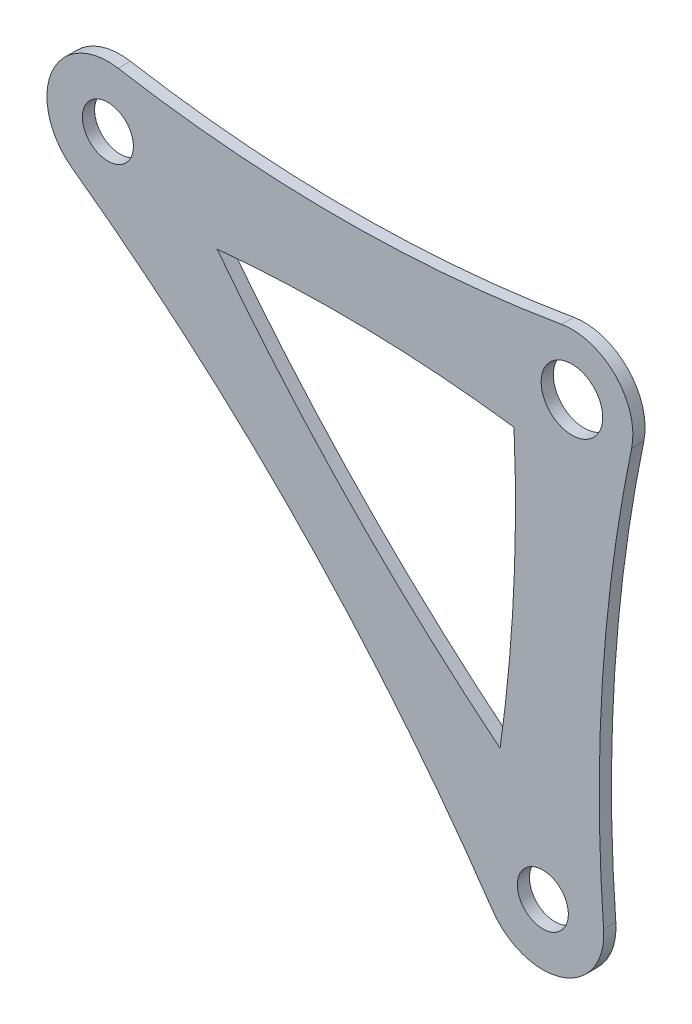
ISO-10303-21;
HEADER;
FILE_DESCRIPTION(('STEP AP214'),'2;1');
FILE_NAME('part.step','',(''),(''),'','','');
FILE_SCHEMA(('AUTOMOTIVE_DESIGN { 1 0 10303 214 1 1 1 1 }'));
ENDSEC;
DATA;
#1=APPLICATION_CONTEXT('core data for automotive mechanical design processes');
#2=APPLICATION_PROTOCOL_DEFINITION('international standard','automotive_design',2000,#1);
#3=PRODUCT_CONTEXT('',#1,'mechanical');
#4=PRODUCT('Part','Part','',(#3));
#5=PRODUCT_RELATED_PRODUCT_CATEGORY('part','',(#4));
#6=PRODUCT_DEFINITION_FORMATION('','',#4);
#7=PRODUCT_DEFINITION_CONTEXT('part definition',#1,'design');
#8=PRODUCT_DEFINITION('design','',#6,#7);
#9=PRODUCT_DEFINITION_SHAPE('','',#8);
#10=(LENGTH_UNIT() NAMED_UNIT(*) SI_UNIT(.MILLI.,.METRE.));
#11=(NAMED_UNIT(*) PLANE_ANGLE_UNIT() SI_UNIT($,.RADIAN.));
#12=(NAMED_UNIT(*) SI_UNIT($,.STERADIAN.) SOLID_ANGLE_UNIT());
#13=UNCERTAINTY_MEASURE_WITH_UNIT(LENGTH_MEASURE(1.E-05),#10,'distance_accuracy_value','');
#14=(GEOMETRIC_REPRESENTATION_CONTEXT(3) GLOBAL_UNCERTAINTY_ASSIGNED_CONTEXT((#13)) GLOBAL_UNIT_ASSIGNED_CONTEXT((#10,
#11,#12)) REPRESENTATION_CONTEXT('',''));
#15=CARTESIAN_POINT('',(0.,0.,0.));
#16=DIRECTION('',(0.,0.,1.));
#17=DIRECTION('',(1.,0.,0.));
#18=AXIS2_PLACEMENT_3D('',#15,#16,#17);
#19=CARTESIAN_POINT('',(-30.03,175.33696472792,1.58));
#20=DIRECTION('',(0.,0.,-1.));
#21=DIRECTION('',(-1.,0.,0.));
#22=AXIS2_PLACEMENT_3D('',#19,#20,#21);
#23=CYLINDRICAL_SURFACE('',#22,170.);
#24=CARTESIAN_POINT('',(-30.03,175.33696472792,0.));
#25=DIRECTION('',(0.,0.,1.));
#26=DIRECTION('',(1.,0.,0.));
#27=AXIS2_PLACEMENT_3D('',#24,#25,#26);
#28=CIRCLE('',#27,170.);
#29=CARTESIAN_POINT('',(-1.33192815785036,7.77676458318788,0.));
#30=VERTEX_POINT('',#29);
#31=CARTESIAN_POINT('',(-58.7280718421496,7.77676458318788,0.));
#32=VERTEX_POINT('',#31);
#33=EDGE_CURVE('E178',#30,#32,#28,.F.);
#34=ORIENTED_EDGE('',*,*,#33,.T.);
#35=DIRECTION('',(0.,0.,-1.));
#36=VECTOR('',#35,1.);
#37=CARTESIAN_POINT('',(-58.7280718421496,7.77676458318788,1.58));
#38=LINE('',#37,#36);
#39=CARTESIAN_POINT('',(-58.7280718421496,7.77676458318788,1.58));
#40=VERTEX_POINT('',#39);
#41=EDGE_CURVE('E11',#40,#32,#38,.T.);
#42=ORIENTED_EDGE('',*,*,#41,.F.);
#43=CARTESIAN_POINT('',(-30.03,175.33696472792,1.58));
#44=DIRECTION('',(0.,0.,1.));
#45=DIRECTION('',(1.,0.,0.));
#46=AXIS2_PLACEMENT_3D('',#43,#44,#45);
#47=CIRCLE('',#46,170.);
#48=CARTESIAN_POINT('',(-1.33192815785036,7.77676458318788,1.58));
#49=VERTEX_POINT('',#48);
#50=EDGE_CURVE('E242',#49,#40,#47,.F.);
#51=ORIENTED_EDGE('',*,*,#50,.F.);
#52=DIRECTION('',(0.,0.,-1.));
#53=VECTOR('',#52,1.);
#54=CARTESIAN_POINT('',(-1.33192815785036,7.77676458318788,1.58));
#55=LINE('',#54,#53);
#56=EDGE_CURVE('E207',#49,#30,#55,.T.);
#57=ORIENTED_EDGE('',*,*,#56,.T.);
#58=EDGE_LOOP('',(#34,#42,#51,#57));
#59=FACE_BOUND('',#58,.T.);
#60=ADVANCED_FACE('F41',(#59),#23,.F.);
#61=CARTESIAN_POINT('',(-60.06,0.,1.58));
#62=DIRECTION('',(0.,0.,-1.));
#63=DIRECTION('',(-1.,0.,0.));
#64=AXIS2_PLACEMENT_3D('',#61,#62,#63);
#65=CYLINDRICAL_SURFACE('',#64,7.89);
#66=CARTESIAN_POINT('',(-60.06,0.,0.));
#67=DIRECTION('',(0.,0.,1.));
#68=DIRECTION('',(1.,0.,0.));
#69=AXIS2_PLACEMENT_3D('',#66,#67,#68);
#70=CIRCLE('',#69,7.89);
#71=CARTESIAN_POINT('',(-64.6781402375793,-6.39725571992014,0.));
#72=VERTEX_POINT('',#71);
#73=EDGE_CURVE('E182',#32,#72,#70,.T.);
#74=ORIENTED_EDGE('',*,*,#73,.T.);
#75=DIRECTION('',(0.,0.,-1.));
#76=VECTOR('',#75,1.);
#77=CARTESIAN_POINT('',(-64.6781402375793,-6.39725571992014,1.58));
#78=LINE('',#77,#76);
#79=CARTESIAN_POINT('',(-64.6781402375793,-6.39725571992014,1.58));
#80=VERTEX_POINT('',#79);
#81=EDGE_CURVE('E52',#80,#72,#78,.T.);
#82=ORIENTED_EDGE('',*,*,#81,.F.);
#83=CARTESIAN_POINT('',(-60.06,0.,1.58));
#84=DIRECTION('',(0.,0.,1.));
#85=DIRECTION('',(1.,0.,0.));
#86=AXIS2_PLACEMENT_3D('',#83,#84,#85);
#87=CIRCLE('',#86,7.89);
#88=EDGE_CURVE('E247',#40,#80,#87,.T.);
#89=ORIENTED_EDGE('',*,*,#88,.F.);
#90=ORIENTED_EDGE('',*,*,#41,.T.);
#91=EDGE_LOOP('',(#74,#82,#89,#90));
#92=FACE_BOUND('',#91,.T.);
#93=ADVANCED_FACE('F261',(#92),#65,.T.);
#94=CARTESIAN_POINT('',(-196.374154617217,-188.828502485704,1.58));
#95=DIRECTION('',(0.,0.,-1.));
#96=DIRECTION('',(-1.,0.,0.));
#97=AXIS2_PLACEMENT_3D('',#94,#95,#96);
#98=CYLINDRICAL_SURFACE('',#97,225.);
#99=CARTESIAN_POINT('',(-196.374154617217,-188.828502485704,0.));
#100=DIRECTION('',(0.,0.,1.));
#101=DIRECTION('',(1.,0.,0.));
#102=AXIS2_PLACEMENT_3D('',#99,#100,#101);
#103=CIRCLE('',#102,225.);
#104=CARTESIAN_POINT('',(-10.2923908909579,-62.3430202811258,0.));
#105=VERTEX_POINT('',#104);
#106=EDGE_CURVE('E185',#72,#105,#103,.F.);
#107=ORIENTED_EDGE('',*,*,#106,.T.);
#108=DIRECTION('',(0.,0.,-1.));
#109=VECTOR('',#108,1.);
#110=CARTESIAN_POINT('',(-10.2923908909579,-62.3430202811258,1.58));
#111=LINE('',#110,#109);
#112=CARTESIAN_POINT('',(-10.2923908909579,-62.3430202811258,1.58));
#113=VERTEX_POINT('',#112);
#114=EDGE_CURVE('E142',#113,#105,#111,.T.);
#115=ORIENTED_EDGE('',*,*,#114,.F.);
#116=CARTESIAN_POINT('',(-196.374154617217,-188.828502485704,1.58));
#117=DIRECTION('',(0.,0.,1.));
#118=DIRECTION('',(1.,0.,0.));
#119=AXIS2_PLACEMENT_3D('',#116,#117,#118);
#120=CIRCLE('',#119,225.);
#121=EDGE_CURVE('E131',#80,#113,#120,.F.);
#122=ORIENTED_EDGE('',*,*,#121,.F.);
#123=ORIENTED_EDGE('',*,*,#81,.T.);
#124=EDGE_LOOP('',(#107,#115,#122,#123));
#125=FACE_BOUND('',#124,.T.);
#126=ADVANCED_FACE('F264',(#125),#98,.F.);
#127=CARTESIAN_POINT('',(-3.76712370962372,-57.9075960384852,1.58));
#128=DIRECTION('',(0.,0.,-1.));
#129=DIRECTION('',(-1.,0.,0.));
#130=AXIS2_PLACEMENT_3D('',#127,#128,#129);
#131=CYLINDRICAL_SURFACE('',#130,7.89);
#132=CARTESIAN_POINT('',(-3.76712370962372,-57.9075960384852,0.));
#133=DIRECTION('',(0.,0.,1.));
#134=DIRECTION('',(1.,0.,0.));
#135=AXIS2_PLACEMENT_3D('',#132,#133,#134);
#136=CIRCLE('',#135,7.89);
#137=CARTESIAN_POINT('',(4.10065843107563,-57.3159000130698,0.));
#138=VERTEX_POINT('',#137);
#139=EDGE_CURVE('E140',#105,#138,#136,.T.);
#140=ORIENTED_EDGE('',*,*,#139,.T.);
#141=DIRECTION('',(0.,0.,-1.));
#142=VECTOR('',#141,1.);
#143=CARTESIAN_POINT('',(4.10065843107563,-57.3159000130698,1.58));
#144=LINE('',#143,#142);
#145=CARTESIAN_POINT('',(4.10065843107563,-57.3159000130698,1.58));
#146=VERTEX_POINT('',#145);
#147=EDGE_CURVE('E137',#146,#138,#144,.T.);
#148=ORIENTED_EDGE('',*,*,#147,.F.);
#149=CARTESIAN_POINT('',(-3.76712370962372,-57.9075960384852,1.58));
#150=DIRECTION('',(0.,0.,1.));
#151=DIRECTION('',(1.,0.,0.));
#152=AXIS2_PLACEMENT_3D('',#149,#150,#151);
#153=CIRCLE('',#152,7.89);
#154=EDGE_CURVE('E124',#113,#146,#153,.T.);
#155=ORIENTED_EDGE('',*,*,#154,.F.);
#156=ORIENTED_EDGE('',*,*,#114,.T.);
#157=EDGE_LOOP('',(#140,#148,#155,#156));
#158=FACE_BOUND('',#157,.T.);
#159=ADVANCED_FACE('F138',(#158),#131,.T.);
#160=CARTESIAN_POINT('',(203.537468081249,-42.317268190119,1.58));
#161=DIRECTION('',(0.,0.,-1.));
#162=DIRECTION('',(-1.,0.,0.));
#163=AXIS2_PLACEMENT_3D('',#160,#161,#162);
#164=CYLINDRICAL_SURFACE('',#163,200.);
#165=CARTESIAN_POINT('',(203.537468081249,-42.317268190119,0.));
#166=DIRECTION('',(0.,0.,1.));
#167=DIRECTION('',(1.,0.,0.));
#168=AXIS2_PLACEMENT_3D('',#165,#166,#167);
#169=CIRCLE('',#168,200.);
#170=CARTESIAN_POINT('',(7.72480938554551,-1.60605727076838,0.));
#171=VERTEX_POINT('',#170);
#172=EDGE_CURVE('E93',#138,#171,#169,.F.);
#173=ORIENTED_EDGE('',*,*,#172,.T.);
#174=DIRECTION('',(0.,0.,-1.));
#175=VECTOR('',#174,1.);
#176=CARTESIAN_POINT('',(7.72480938554551,-1.60605727076838,1.58));
#177=LINE('',#176,#175);
#178=CARTESIAN_POINT('',(7.72480938554551,-1.60605727076838,1.58));
#179=VERTEX_POINT('',#178);
#180=EDGE_CURVE('E143',#179,#171,#177,.T.);
#181=ORIENTED_EDGE('',*,*,#180,.F.);
#182=CARTESIAN_POINT('',(203.537468081249,-42.317268190119,1.58));
#183=DIRECTION('',(0.,0.,1.));
#184=DIRECTION('',(1.,0.,0.));
#185=AXIS2_PLACEMENT_3D('',#182,#183,#184);
#186=CIRCLE('',#185,200.);
#187=EDGE_CURVE('E129',#146,#179,#186,.F.);
#188=ORIENTED_EDGE('',*,*,#187,.F.);
#189=ORIENTED_EDGE('',*,*,#147,.T.);
#190=EDGE_LOOP('',(#173,#181,#188,#189));
#191=FACE_BOUND('',#190,.T.);
#192=ADVANCED_FACE('F145',(#191),#164,.F.);
#193=CARTESIAN_POINT('',(132.547030907594,130.920906447219,1.58));
#194=DIRECTION('',(0.,0.,-1.));
#195=DIRECTION('',(-1.,0.,0.));
#196=AXIS2_PLACEMENT_3D('',#193,#194,#195);
#197=CYLINDRICAL_SURFACE('',#196,225.);
#198=CARTESIAN_POINT('',(132.547030907594,130.920906447219,0.));
#199=DIRECTION('',(0.,0.,1.));
#200=DIRECTION('',(1.,0.,0.));
#201=AXIS2_PLACEMENT_3D('',#198,#199,#200);
#202=CIRCLE('',#201,225.);
#203=CARTESIAN_POINT('',(-45.9329006907997,-6.08242933929765,0.));
#204=VERTEX_POINT('',#203);
#205=CARTESIAN_POINT('',(-9.29524167465695,-43.7381033653376,0.));
#206=VERTEX_POINT('',#205);
#207=EDGE_CURVE('E166',#204,#206,#202,.T.);
#208=ORIENTED_EDGE('',*,*,#207,.F.);
#209=DIRECTION('',(0.,0.,-1.));
#210=VECTOR('',#209,1.);
#211=CARTESIAN_POINT('',(-45.9329006907997,-6.08242933929765,1.58));
#212=LINE('',#211,#210);
#213=CARTESIAN_POINT('',(-45.9329006907997,-6.08242933929765,1.58));
#214=VERTEX_POINT('',#213);
#215=EDGE_CURVE('E45',#214,#204,#212,.T.);
#216=ORIENTED_EDGE('',*,*,#215,.F.);
#217=CARTESIAN_POINT('',(132.547030907594,130.920906447219,1.58));
#218=DIRECTION('',(0.,0.,1.));
#219=DIRECTION('',(1.,0.,0.));
#220=AXIS2_PLACEMENT_3D('',#217,#218,#219);
#221=CIRCLE('',#220,225.);
#222=CARTESIAN_POINT('',(-9.29524167465695,-43.7381033653376,1.58));
#223=VERTEX_POINT('',#222);
#224=EDGE_CURVE('E206',#214,#223,#221,.T.);
#225=ORIENTED_EDGE('',*,*,#224,.T.);
#226=DIRECTION('',(0.,0.,-1.));
#227=VECTOR('',#226,1.);
#228=CARTESIAN_POINT('',(-9.29524167465695,-43.7381033653376,1.58));
#229=LINE('',#228,#227);
#230=EDGE_CURVE('E165',#223,#206,#229,.T.);
#231=ORIENTED_EDGE('',*,*,#230,.T.);
#232=EDGE_LOOP('',(#208,#216,#225,#231));
#233=FACE_BOUND('',#232,.T.);
#234=ADVANCED_FACE('F43',(#233),#197,.F.);
#235=CARTESIAN_POINT('',(-30.03,-175.33696472792,1.58));
#236=DIRECTION('',(0.,0.,-1.));
#237=DIRECTION('',(-1.,0.,0.));
#238=AXIS2_PLACEMENT_3D('',#235,#236,#237);
#239=CYLINDRICAL_SURFACE('',#238,170.);
#240=CARTESIAN_POINT('',(-30.03,-175.33696472792,0.));
#241=DIRECTION('',(0.,0.,1.));
#242=DIRECTION('',(1.,0.,0.));
#243=AXIS2_PLACEMENT_3D('',#240,#241,#242);
#244=CIRCLE('',#243,170.);
#245=CARTESIAN_POINT('',(-7.49623434821273,-6.83702583905814,0.));
#246=VERTEX_POINT('',#245);
#247=EDGE_CURVE('E170',#246,#204,#244,.T.);
#248=ORIENTED_EDGE('',*,*,#247,.F.);
#249=DIRECTION('',(0.,0.,-1.));
#250=VECTOR('',#249,1.);
#251=CARTESIAN_POINT('',(-7.49623434821273,-6.83702583905814,1.58));
#252=LINE('',#251,#250);
#253=CARTESIAN_POINT('',(-7.49623434821273,-6.83702583905814,1.58));
#254=VERTEX_POINT('',#253);
#255=EDGE_CURVE('E218',#254,#246,#252,.T.);
#256=ORIENTED_EDGE('',*,*,#255,.F.);
#257=CARTESIAN_POINT('',(-30.03,-175.33696472792,1.58));
#258=DIRECTION('',(0.,0.,1.));
#259=DIRECTION('',(1.,0.,0.));
#260=AXIS2_PLACEMENT_3D('',#257,#258,#259);
#261=CIRCLE('',#260,170.);
#262=EDGE_CURVE('E231',#254,#214,#261,.T.);
#263=ORIENTED_EDGE('',*,*,#262,.T.);
#264=ORIENTED_EDGE('',*,*,#215,.T.);
#265=EDGE_LOOP('',(#248,#256,#263,#264));
#266=FACE_BOUND('',#265,.T.);
#267=ADVANCED_FACE('F229',(#266),#239,.F.);
#268=CARTESIAN_POINT('',(0.,0.,1.58));
#269=DIRECTION('',(0.,0.,-1.));
#270=DIRECTION('',(-1.,0.,0.));
#271=AXIS2_PLACEMENT_3D('',#268,#269,#270);
#272=CYLINDRICAL_SURFACE('',#271,3.985);
#273=CARTESIAN_POINT('',(0.,0.,1.58));
#274=DIRECTION('',(0.,0.,1.));
#275=DIRECTION('',(1.,0.,0.));
#276=AXIS2_PLACEMENT_3D('',#273,#274,#275);
#277=CIRCLE('',#276,3.985);
#278=CARTESIAN_POINT('',(-3.985,0.,1.58));
#279=VERTEX_POINT('',#278);
#280=EDGE_CURVE('E157',#279,#279,#277,.T.);
#281=CARTESIAN_POINT('',(0.,0.,0.));
#282=DIRECTION('',(0.,0.,1.));
#283=DIRECTION('',(1.,0.,0.));
#284=AXIS2_PLACEMENT_3D('',#281,#282,#283);
#285=CIRCLE('',#284,3.985);
#286=CARTESIAN_POINT('',(-3.985,0.,0.));
#287=VERTEX_POINT('',#286);
#288=EDGE_CURVE('E198',#287,#287,#285,.T.);
#289=CARTESIAN_POINT('',(-3.985,0.,1.58));
#290=CARTESIAN_POINT('',(-3.985,0.,1.56354166666667));
#291=CARTESIAN_POINT('',(-3.985,0.,1.54708333333333));
#292=CARTESIAN_POINT('',(-3.985,0.,1.51416666666667));
#293=CARTESIAN_POINT('',(-3.985,0.,1.49770833333333));
#294=CARTESIAN_POINT('',(-3.985,0.,1.46479166666667));
#295=CARTESIAN_POINT('',(-3.985,0.,1.44833333333333));
#296=CARTESIAN_POINT('',(-3.985,0.,1.41541666666667));
#297=CARTESIAN_POINT('',(-3.985,0.,1.39895833333333));
#298=CARTESIAN_POINT('',(-3.985,0.,1.36604166666667));
#299=CARTESIAN_POINT('',(-3.985,0.,1.34958333333333));
#300=CARTESIAN_POINT('',(-3.985,0.,1.31666666666667));
#301=CARTESIAN_POINT('',(-3.985,0.,1.30020833333333));
#302=CARTESIAN_POINT('',(-3.985,0.,1.26729166666667));
#303=CARTESIAN_POINT('',(-3.985,0.,1.25083333333333));
#304=CARTESIAN_POINT('',(-3.985,0.,1.21791666666667));
#305=CARTESIAN_POINT('',(-3.985,0.,1.20145833333333));
#306=CARTESIAN_POINT('',(-3.985,0.,1.16854166666667));
#307=CARTESIAN_POINT('',(-3.985,0.,1.15208333333333));
#308=CARTESIAN_POINT('',(-3.985,0.,1.11916666666667));
#309=CARTESIAN_POINT('',(-3.985,0.,1.10270833333333));
#310=CARTESIAN_POINT('',(-3.985,0.,1.06979166666667));
#311=CARTESIAN_POINT('',(-3.985,0.,1.05333333333333));
#312=CARTESIAN_POINT('',(-3.985,0.,1.02041666666667));
#313=CARTESIAN_POINT('',(-3.985,0.,1.00395833333333));
#314=CARTESIAN_POINT('',(-3.985,0.,0.971041666666667));
#315=CARTESIAN_POINT('',(-3.985,0.,0.954583333333333));
#316=CARTESIAN_POINT('',(-3.985,0.,0.921666666666667));
#317=CARTESIAN_POINT('',(-3.985,0.,0.905208333333333));
#318=CARTESIAN_POINT('',(-3.985,0.,0.872291666666667));
#319=CARTESIAN_POINT('',(-3.985,0.,0.855833333333333));
#320=CARTESIAN_POINT('',(-3.985,0.,0.822916666666667));
#321=CARTESIAN_POINT('',(-3.985,0.,0.806458333333333));
#322=CARTESIAN_POINT('',(-3.985,0.,0.773541666666667));
#323=CARTESIAN_POINT('',(-3.985,0.,0.757083333333333));
#324=CARTESIAN_POINT('',(-3.985,0.,0.724166666666667));
#325=CARTESIAN_POINT('',(-3.985,0.,0.707708333333333));
#326=CARTESIAN_POINT('',(-3.985,0.,0.674791666666667));
#327=CARTESIAN_POINT('',(-3.985,0.,0.658333333333333));
#328=CARTESIAN_POINT('',(-3.985,0.,0.625416666666667));
#329=CARTESIAN_POINT('',(-3.985,0.,0.608958333333333));
#330=CARTESIAN_POINT('',(-3.985,0.,0.576041666666667));
#331=CARTESIAN_POINT('',(-3.985,0.,0.559583333333333));
#332=CARTESIAN_POINT('',(-3.985,0.,0.526666666666667));
#333=CARTESIAN_POINT('',(-3.985,0.,0.510208333333333));
#334=CARTESIAN_POINT('',(-3.985,0.,0.477291666666667));
#335=CARTESIAN_POINT('',(-3.985,0.,0.460833333333333));
#336=CARTESIAN_POINT('',(-3.985,0.,0.427916666666667));
#337=CARTESIAN_POINT('',(-3.985,0.,0.411458333333333));
#338=CARTESIAN_POINT('',(-3.985,0.,0.378541666666667));
#339=CARTESIAN_POINT('',(-3.985,0.,0.362083333333333));
#340=CARTESIAN_POINT('',(-3.985,0.,0.329166666666667));
#341=CARTESIAN_POINT('',(-3.985,0.,0.312708333333333));
#342=CARTESIAN_POINT('',(-3.985,0.,0.279791666666667));
#343=CARTESIAN_POINT('',(-3.985,0.,0.263333333333333));
#344=CARTESIAN_POINT('',(-3.985,0.,0.230416666666667));
#345=CARTESIAN_POINT('',(-3.985,0.,0.213958333333333));
#346=CARTESIAN_POINT('',(-3.985,0.,0.181041666666667));
#347=CARTESIAN_POINT('',(-3.985,0.,0.164583333333333));
#348=CARTESIAN_POINT('',(-3.985,0.,0.131666666666667));
#349=CARTESIAN_POINT('',(-3.985,0.,0.115208333333333));
#350=CARTESIAN_POINT('',(-3.985,0.,0.0822916666666667));
#351=CARTESIAN_POINT('',(-3.985,0.,0.0658333333333333));
#352=CARTESIAN_POINT('',(-3.985,0.,0.0329166666666666));
#353=CARTESIAN_POINT('',(-3.985,0.,0.0164583333333333));
#354=CARTESIAN_POINT('',(-3.985,0.,0.));
#355=B_SPLINE_CURVE_WITH_KNOTS('',3,(#289,#290,#291,#292,#293,#294,#295,#296,#297,#298,#299,
#300,#301,#302,#303,#304,#305,#306,#307,#308,#309,#310,#311,#312,#313,#314,#315,#316,#317,#318,
#319,#320,#321,#322,#323,#324,#325,#326,#327,#328,#329,#330,#331,#332,#333,#334,#335,#336,#337,
#338,#339,#340,#341,#342,#343,#344,#345,#346,#347,#348,#349,#350,#351,#352,#353,#354),
.UNSPECIFIED.,.F.,.F.,(4,2,2,2,2,2,2,2,2,2,2,2,2,2,2,2,2,2,2,2,2,2,2,2,2,2,2,2,2,2,2,2,4),(0.,
0.0493750000000002,0.0987500000000001,0.148125,0.1975,0.246875,0.29625,0.345625,0.395,0.444375,
0.49375,0.543125,0.5925,0.641875,0.69125,0.740625,0.79,0.839375,0.88875,0.938125,0.9875,
1.036875,1.08625,1.135625,1.185,1.234375,1.28375,1.333125,1.3825,1.431875,1.48125,1.530625,
1.58),.UNSPECIFIED.);
#356=EDGE_CURVE('BSEAM278',#279,#287,#355,.T.);
#357=ORIENTED_EDGE('',*,*,#280,.T.);
#358=ORIENTED_EDGE('',*,*,#288,.F.);
#359=ORIENTED_EDGE('',*,*,#356,.T.);
#360=ORIENTED_EDGE('',*,*,#356,.F.);
#361=EDGE_LOOP('',(#357,#359,#358,#360));
#362=FACE_BOUND('',#361,.T.);
#363=ADVANCED_FACE('F278',(#362),#272,.F.);
#364=CARTESIAN_POINT('',(-3.76712370962372,-57.9075960384852,1.58));
#365=DIRECTION('',(0.,0.,-1.));
#366=DIRECTION('',(-1.,0.,0.));
#367=AXIS2_PLACEMENT_3D('',#364,#365,#366);
#368=CYLINDRICAL_SURFACE('',#367,3.30000000000001);
#369=CARTESIAN_POINT('',(-3.76712370962372,-57.9075960384852,1.58));
#370=DIRECTION('',(0.,0.,1.));
#371=DIRECTION('',(1.,0.,0.));
#372=AXIS2_PLACEMENT_3D('',#369,#370,#371);
#373=CIRCLE('',#372,3.30000000000001);
#374=CARTESIAN_POINT('',(-7.06712370962372,-57.9075960384852,1.58));
#375=VERTEX_POINT('',#374);
#376=EDGE_CURVE('E150',#375,#375,#373,.T.);
#377=CARTESIAN_POINT('',(-3.76712370962372,-57.9075960384852,0.));
#378=DIRECTION('',(0.,0.,1.));
#379=DIRECTION('',(1.,0.,0.));
#380=AXIS2_PLACEMENT_3D('',#377,#378,#379);
#381=CIRCLE('',#380,3.30000000000001);
#382=CARTESIAN_POINT('',(-7.06712370962372,-57.9075960384852,0.));
#383=VERTEX_POINT('',#382);
#384=EDGE_CURVE('E194',#383,#383,#381,.T.);
#385=CARTESIAN_POINT('',(-7.06712370962372,-57.9075960384852,1.58));
#386=CARTESIAN_POINT('',(-7.06712370962372,-57.9075960384852,1.56354166666667));
#387=CARTESIAN_POINT('',(-7.06712370962372,-57.9075960384852,1.54708333333333));
#388=CARTESIAN_POINT('',(-7.06712370962372,-57.9075960384852,1.51416666666667));
#389=CARTESIAN_POINT('',(-7.06712370962372,-57.9075960384852,1.49770833333333));
#390=CARTESIAN_POINT('',(-7.06712370962372,-57.9075960384852,1.46479166666667));
#391=CARTESIAN_POINT('',(-7.06712370962372,-57.9075960384852,1.44833333333333));
#392=CARTESIAN_POINT('',(-7.06712370962372,-57.9075960384852,1.41541666666667));
#393=CARTESIAN_POINT('',(-7.06712370962372,-57.9075960384852,1.39895833333333));
#394=CARTESIAN_POINT('',(-7.06712370962372,-57.9075960384852,1.36604166666667));
#395=CARTESIAN_POINT('',(-7.06712370962372,-57.9075960384852,1.34958333333333));
#396=CARTESIAN_POINT('',(-7.06712370962372,-57.9075960384852,1.31666666666667));
#397=CARTESIAN_POINT('',(-7.06712370962372,-57.9075960384852,1.30020833333333));
#398=CARTESIAN_POINT('',(-7.06712370962372,-57.9075960384852,1.26729166666667));
#399=CARTESIAN_POINT('',(-7.06712370962372,-57.9075960384852,1.25083333333333));
#400=CARTESIAN_POINT('',(-7.06712370962372,-57.9075960384852,1.21791666666667));
#401=CARTESIAN_POINT('',(-7.06712370962372,-57.9075960384852,1.20145833333333));
#402=CARTESIAN_POINT('',(-7.06712370962372,-57.9075960384852,1.16854166666667));
#403=CARTESIAN_POINT('',(-7.06712370962372,-57.9075960384852,1.15208333333333));
#404=CARTESIAN_POINT('',(-7.06712370962372,-57.9075960384852,1.11916666666667));
#405=CARTESIAN_POINT('',(-7.06712370962372,-57.9075960384852,1.10270833333333));
#406=CARTESIAN_POINT('',(-7.06712370962372,-57.9075960384852,1.06979166666667));
#407=CARTESIAN_POINT('',(-7.06712370962372,-57.9075960384852,1.05333333333333));
#408=CARTESIAN_POINT('',(-7.06712370962372,-57.9075960384852,1.02041666666667));
#409=CARTESIAN_POINT('',(-7.06712370962372,-57.9075960384852,1.00395833333333));
#410=CARTESIAN_POINT('',(-7.06712370962372,-57.9075960384852,0.971041666666667));
#411=CARTESIAN_POINT('',(-7.06712370962372,-57.9075960384852,0.954583333333333));
#412=CARTESIAN_POINT('',(-7.06712370962372,-57.9075960384852,0.921666666666667));
#413=CARTESIAN_POINT('',(-7.06712370962372,-57.9075960384852,0.905208333333333));
#414=CARTESIAN_POINT('',(-7.06712370962372,-57.9075960384852,0.872291666666667));
#415=CARTESIAN_POINT('',(-7.06712370962372,-57.9075960384852,0.855833333333333));
#416=CARTESIAN_POINT('',(-7.06712370962372,-57.9075960384852,0.822916666666667));
#417=CARTESIAN_POINT('',(-7.06712370962372,-57.9075960384852,0.806458333333333));
#418=CARTESIAN_POINT('',(-7.06712370962372,-57.9075960384852,0.773541666666667));
#419=CARTESIAN_POINT('',(-7.06712370962372,-57.9075960384852,0.757083333333333));
#420=CARTESIAN_POINT('',(-7.06712370962372,-57.9075960384852,0.724166666666667));
#421=CARTESIAN_POINT('',(-7.06712370962372,-57.9075960384852,0.707708333333333));
#422=CARTESIAN_POINT('',(-7.06712370962372,-57.9075960384852,0.674791666666667));
#423=CARTESIAN_POINT('',(-7.06712370962372,-57.9075960384852,0.658333333333333));
#424=CARTESIAN_POINT('',(-7.06712370962372,-57.9075960384852,0.625416666666667));
#425=CARTESIAN_POINT('',(-7.06712370962372,-57.9075960384852,0.608958333333333));
#426=CARTESIAN_POINT('',(-7.06712370962372,-57.9075960384852,0.576041666666667));
#427=CARTESIAN_POINT('',(-7.06712370962372,-57.9075960384852,0.559583333333333));
#428=CARTESIAN_POINT('',(-7.06712370962372,-57.9075960384852,0.526666666666667));
#429=CARTESIAN_POINT('',(-7.06712370962372,-57.9075960384852,0.510208333333333));
#430=CARTESIAN_POINT('',(-7.06712370962372,-57.9075960384852,0.477291666666667));
#431=CARTESIAN_POINT('',(-7.06712370962372,-57.9075960384852,0.460833333333333));
#432=CARTESIAN_POINT('',(-7.06712370962372,-57.9075960384852,0.427916666666667));
#433=CARTESIAN_POINT('',(-7.06712370962372,-57.9075960384852,0.411458333333333));
#434=CARTESIAN_POINT('',(-7.06712370962372,-57.9075960384852,0.378541666666667));
#435=CARTESIAN_POINT('',(-7.06712370962372,-57.9075960384852,0.362083333333333));
#436=CARTESIAN_POINT('',(-7.06712370962372,-57.9075960384852,0.329166666666667));
#437=CARTESIAN_POINT('',(-7.06712370962372,-57.9075960384852,0.312708333333333));
#438=CARTESIAN_POINT('',(-7.06712370962372,-57.9075960384852,0.279791666666667));
#439=CARTESIAN_POINT('',(-7.06712370962372,-57.9075960384852,0.263333333333333));
#440=CARTESIAN_POINT('',(-7.06712370962372,-57.9075960384852,0.230416666666667));
#441=CARTESIAN_POINT('',(-7.06712370962372,-57.9075960384852,0.213958333333333));
#442=CARTESIAN_POINT('',(-7.06712370962372,-57.9075960384852,0.181041666666667));
#443=CARTESIAN_POINT('',(-7.06712370962372,-57.9075960384852,0.164583333333333));
#444=CARTESIAN_POINT('',(-7.06712370962372,-57.9075960384852,0.131666666666667));
#445=CARTESIAN_POINT('',(-7.06712370962372,-57.9075960384852,0.115208333333333));
#446=CARTESIAN_POINT('',(-7.06712370962372,-57.9075960384852,0.0822916666666667));
#447=CARTESIAN_POINT('',(-7.06712370962372,-57.9075960384852,0.0658333333333333));
#448=CARTESIAN_POINT('',(-7.06712370962372,-57.9075960384852,0.0329166666666666));
#449=CARTESIAN_POINT('',(-7.06712370962372,-57.9075960384852,0.0164583333333333));
#450=CARTESIAN_POINT('',(-7.06712370962372,-57.9075960384852,0.));
#451=B_SPLINE_CURVE_WITH_KNOTS('',3,(#385,#386,#387,#388,#389,#390,#391,#392,#393,#394,#395,
#396,#397,#398,#399,#400,#401,#402,#403,#404,#405,#406,#407,#408,#409,#410,#411,#412,#413,#414,
#415,#416,#417,#418,#419,#420,#421,#422,#423,#424,#425,#426,#427,#428,#429,#430,#431,#432,#433,
#434,#435,#436,#437,#438,#439,#440,#441,#442,#443,#444,#445,#446,#447,#448,#449,#450),
.UNSPECIFIED.,.F.,.F.,(4,2,2,2,2,2,2,2,2,2,2,2,2,2,2,2,2,2,2,2,2,2,2,2,2,2,2,2,2,2,2,2,4),(0.,
0.0493750000000002,0.0987500000000001,0.148125,0.1975,0.246875,0.29625,0.345625,0.395,0.444375,
0.49375,0.543125,0.5925,0.641875,0.69125,0.740625,0.79,0.839375,0.88875,0.938125,0.9875,
1.036875,1.08625,1.135625,1.185,1.234375,1.28375,1.333125,1.3825,1.431875,1.48125,1.530625,
1.58),.UNSPECIFIED.);
#452=EDGE_CURVE('BSEAM270',#375,#383,#451,.T.);
#453=ORIENTED_EDGE('',*,*,#376,.T.);
#454=ORIENTED_EDGE('',*,*,#384,.F.);
#455=ORIENTED_EDGE('',*,*,#452,.T.);
#456=ORIENTED_EDGE('',*,*,#452,.F.);
#457=EDGE_LOOP('',(#453,#455,#454,#456));
#458=FACE_BOUND('',#457,.T.);
#459=ADVANCED_FACE('F270',(#458),#368,.F.);
#460=CARTESIAN_POINT('',(0.,0.,1.58));
#461=DIRECTION('',(0.,0.,-1.));
#462=DIRECTION('',(-1.,0.,0.));
#463=AXIS2_PLACEMENT_3D('',#460,#461,#462);
#464=CYLINDRICAL_SURFACE('',#463,7.89);
#465=CARTESIAN_POINT('',(0.,0.,0.));
#466=DIRECTION('',(0.,0.,1.));
#467=DIRECTION('',(1.,0.,0.));
#468=AXIS2_PLACEMENT_3D('',#465,#466,#467);
#469=CIRCLE('',#468,7.89);
#470=EDGE_CURVE('E99',#171,#30,#469,.T.);
#471=ORIENTED_EDGE('',*,*,#470,.T.);
#472=ORIENTED_EDGE('',*,*,#56,.F.);
#473=CARTESIAN_POINT('',(0.,0.,1.58));
#474=DIRECTION('',(0.,0.,1.));
#475=DIRECTION('',(1.,0.,0.));
#476=AXIS2_PLACEMENT_3D('',#473,#474,#475);
#477=CIRCLE('',#476,7.89);
#478=EDGE_CURVE('E61',#179,#49,#477,.T.);
#479=ORIENTED_EDGE('',*,*,#478,.F.);
#480=ORIENTED_EDGE('',*,*,#180,.T.);
#481=EDGE_LOOP('',(#471,#472,#479,#480));
#482=FACE_BOUND('',#481,.T.);
#483=ADVANCED_FACE('F268',(#482),#464,.T.);
#484=CARTESIAN_POINT('',(-207.304591790873,-15.5903278483662,1.58));
#485=DIRECTION('',(0.,0.,-1.));
#486=DIRECTION('',(-1.,0.,0.));
#487=AXIS2_PLACEMENT_3D('',#484,#485,#486);
#488=CYLINDRICAL_SURFACE('',#487,200.);
#489=CARTESIAN_POINT('',(-207.304591790873,-15.5903278483662,0.));
#490=DIRECTION('',(0.,0.,1.));
#491=DIRECTION('',(1.,0.,0.));
#492=AXIS2_PLACEMENT_3D('',#489,#490,#491);
#493=CIRCLE('',#492,200.);
#494=EDGE_CURVE('E174',#206,#246,#493,.T.);
#495=ORIENTED_EDGE('',*,*,#494,.F.);
#496=ORIENTED_EDGE('',*,*,#230,.F.);
#497=CARTESIAN_POINT('',(-207.304591790873,-15.5903278483662,1.58));
#498=DIRECTION('',(0.,0.,1.));
#499=DIRECTION('',(1.,0.,0.));
#500=AXIS2_PLACEMENT_3D('',#497,#498,#499);
#501=CIRCLE('',#500,200.);
#502=EDGE_CURVE('E237',#223,#254,#501,.T.);
#503=ORIENTED_EDGE('',*,*,#502,.T.);
#504=ORIENTED_EDGE('',*,*,#255,.T.);
#505=EDGE_LOOP('',(#495,#496,#503,#504));
#506=FACE_BOUND('',#505,.T.);
#507=ADVANCED_FACE('F235',(#506),#488,.F.);
#508=CARTESIAN_POINT('',(-60.06,0.,1.58));
#509=DIRECTION('',(0.,0.,-1.));
#510=DIRECTION('',(-1.,0.,0.));
#511=AXIS2_PLACEMENT_3D('',#508,#509,#510);
#512=CYLINDRICAL_SURFACE('',#511,3.3);
#513=CARTESIAN_POINT('',(-60.06,0.,1.58));
#514=DIRECTION('',(0.,0.,1.));
#515=DIRECTION('',(1.,0.,0.));
#516=AXIS2_PLACEMENT_3D('',#513,#514,#515);
#517=CIRCLE('',#516,3.3);
#518=CARTESIAN_POINT('',(-63.36,0.,1.58));
#519=VERTEX_POINT('',#518);
#520=EDGE_CURVE('E161',#519,#519,#517,.T.);
#521=CARTESIAN_POINT('',(-60.06,0.,0.));
#522=DIRECTION('',(0.,0.,1.));
#523=DIRECTION('',(1.,0.,0.));
#524=AXIS2_PLACEMENT_3D('',#521,#522,#523);
#525=CIRCLE('',#524,3.3);
#526=CARTESIAN_POINT('',(-63.36,0.,0.));
#527=VERTEX_POINT('',#526);
#528=EDGE_CURVE('E202',#527,#527,#525,.T.);
#529=CARTESIAN_POINT('',(-63.36,0.,1.58));
#530=CARTESIAN_POINT('',(-63.36,0.,1.56354166666667));
#531=CARTESIAN_POINT('',(-63.36,0.,1.54708333333333));
#532=CARTESIAN_POINT('',(-63.36,0.,1.51416666666667));
#533=CARTESIAN_POINT('',(-63.36,0.,1.49770833333333));
#534=CARTESIAN_POINT('',(-63.36,0.,1.46479166666667));
#535=CARTESIAN_POINT('',(-63.36,0.,1.44833333333333));
#536=CARTESIAN_POINT('',(-63.36,0.,1.41541666666667));
#537=CARTESIAN_POINT('',(-63.36,0.,1.39895833333333));
#538=CARTESIAN_POINT('',(-63.36,0.,1.36604166666667));
#539=CARTESIAN_POINT('',(-63.36,0.,1.34958333333333));
#540=CARTESIAN_POINT('',(-63.36,0.,1.31666666666667));
#541=CARTESIAN_POINT('',(-63.36,0.,1.30020833333333));
#542=CARTESIAN_POINT('',(-63.36,0.,1.26729166666667));
#543=CARTESIAN_POINT('',(-63.36,0.,1.25083333333333));
#544=CARTESIAN_POINT('',(-63.36,0.,1.21791666666667));
#545=CARTESIAN_POINT('',(-63.36,0.,1.20145833333333));
#546=CARTESIAN_POINT('',(-63.36,0.,1.16854166666667));
#547=CARTESIAN_POINT('',(-63.36,0.,1.15208333333333));
#548=CARTESIAN_POINT('',(-63.36,0.,1.11916666666667));
#549=CARTESIAN_POINT('',(-63.36,0.,1.10270833333333));
#550=CARTESIAN_POINT('',(-63.36,0.,1.06979166666667));
#551=CARTESIAN_POINT('',(-63.36,0.,1.05333333333333));
#552=CARTESIAN_POINT('',(-63.36,0.,1.02041666666667));
#553=CARTESIAN_POINT('',(-63.36,0.,1.00395833333333));
#554=CARTESIAN_POINT('',(-63.36,0.,0.971041666666667));
#555=CARTESIAN_POINT('',(-63.36,0.,0.954583333333333));
#556=CARTESIAN_POINT('',(-63.36,0.,0.921666666666667));
#557=CARTESIAN_POINT('',(-63.36,0.,0.905208333333333));
#558=CARTESIAN_POINT('',(-63.36,0.,0.872291666666667));
#559=CARTESIAN_POINT('',(-63.36,0.,0.855833333333333));
#560=CARTESIAN_POINT('',(-63.36,0.,0.822916666666667));
#561=CARTESIAN_POINT('',(-63.36,0.,0.806458333333333));
#562=CARTESIAN_POINT('',(-63.36,0.,0.773541666666667));
#563=CARTESIAN_POINT('',(-63.36,0.,0.757083333333333));
#564=CARTESIAN_POINT('',(-63.36,0.,0.724166666666667));
#565=CARTESIAN_POINT('',(-63.36,0.,0.707708333333333));
#566=CARTESIAN_POINT('',(-63.36,0.,0.674791666666667));
#567=CARTESIAN_POINT('',(-63.36,0.,0.658333333333333));
#568=CARTESIAN_POINT('',(-63.36,0.,0.625416666666667));
#569=CARTESIAN_POINT('',(-63.36,0.,0.608958333333333));
#570=CARTESIAN_POINT('',(-63.36,0.,0.576041666666667));
#571=CARTESIAN_POINT('',(-63.36,0.,0.559583333333333));
#572=CARTESIAN_POINT('',(-63.36,0.,0.526666666666667));
#573=CARTESIAN_POINT('',(-63.36,0.,0.510208333333333));
#574=CARTESIAN_POINT('',(-63.36,0.,0.477291666666667));
#575=CARTESIAN_POINT('',(-63.36,0.,0.460833333333333));
#576=CARTESIAN_POINT('',(-63.36,0.,0.427916666666667));
#577=CARTESIAN_POINT('',(-63.36,0.,0.411458333333333));
#578=CARTESIAN_POINT('',(-63.36,0.,0.378541666666667));
#579=CARTESIAN_POINT('',(-63.36,0.,0.362083333333333));
#580=CARTESIAN_POINT('',(-63.36,0.,0.329166666666667));
#581=CARTESIAN_POINT('',(-63.36,0.,0.312708333333333));
#582=CARTESIAN_POINT('',(-63.36,0.,0.279791666666667));
#583=CARTESIAN_POINT('',(-63.36,0.,0.263333333333333));
#584=CARTESIAN_POINT('',(-63.36,0.,0.230416666666667));
#585=CARTESIAN_POINT('',(-63.36,0.,0.213958333333333));
#586=CARTESIAN_POINT('',(-63.36,0.,0.181041666666667));
#587=CARTESIAN_POINT('',(-63.36,0.,0.164583333333333));
#588=CARTESIAN_POINT('',(-63.36,0.,0.131666666666667));
#589=CARTESIAN_POINT('',(-63.36,0.,0.115208333333333));
#590=CARTESIAN_POINT('',(-63.36,0.,0.0822916666666667));
#591=CARTESIAN_POINT('',(-63.36,0.,0.0658333333333333));
#592=CARTESIAN_POINT('',(-63.36,0.,0.0329166666666666));
#593=CARTESIAN_POINT('',(-63.36,0.,0.0164583333333333));
#594=CARTESIAN_POINT('',(-63.36,0.,0.));
#595=B_SPLINE_CURVE_WITH_KNOTS('',3,(#529,#530,#531,#532,#533,#534,#535,#536,#537,#538,#539,
#540,#541,#542,#543,#544,#545,#546,#547,#548,#549,#550,#551,#552,#553,#554,#555,#556,#557,#558,
#559,#560,#561,#562,#563,#564,#565,#566,#567,#568,#569,#570,#571,#572,#573,#574,#575,#576,#577,
#578,#579,#580,#581,#582,#583,#584,#585,#586,#587,#588,#589,#590,#591,#592,#593,#594),
.UNSPECIFIED.,.F.,.F.,(4,2,2,2,2,2,2,2,2,2,2,2,2,2,2,2,2,2,2,2,2,2,2,2,2,2,2,2,2,2,2,2,4),(0.,
0.0493750000000002,0.0987500000000001,0.148125,0.1975,0.246875,0.29625,0.345625,0.395,0.444375,
0.49375,0.543125,0.5925,0.641875,0.69125,0.740625,0.79,0.839375,0.88875,0.938125,0.9875,
1.036875,1.08625,1.135625,1.185,1.234375,1.28375,1.333125,1.3825,1.431875,1.48125,1.530625,
1.58),.UNSPECIFIED.);
#596=EDGE_CURVE('BSEAM276',#519,#527,#595,.T.);
#597=ORIENTED_EDGE('',*,*,#520,.T.);
#598=ORIENTED_EDGE('',*,*,#528,.F.);
#599=ORIENTED_EDGE('',*,*,#596,.T.);
#600=ORIENTED_EDGE('',*,*,#596,.F.);
#601=EDGE_LOOP('',(#597,#599,#598,#600));
#602=FACE_BOUND('',#601,.T.);
#603=ADVANCED_FACE('F276',(#602),#512,.F.);
#604=CARTESIAN_POINT('',(0.,0.,1.58));
#605=DIRECTION('',(0.,0.,1.));
#606=DIRECTION('',(1.,0.,0.));
#607=AXIS2_PLACEMENT_3D('',#604,#605,#606);
#608=PLANE('',#607);
#609=ORIENTED_EDGE('',*,*,#224,.F.);
#610=ORIENTED_EDGE('',*,*,#262,.F.);
#611=ORIENTED_EDGE('',*,*,#502,.F.);
#612=EDGE_LOOP('',(#609,#610,#611));
#613=FACE_BOUND('',#612,.T.);
#614=ORIENTED_EDGE('',*,*,#50,.T.);
#615=ORIENTED_EDGE('',*,*,#88,.T.);
#616=ORIENTED_EDGE('',*,*,#121,.T.);
#617=ORIENTED_EDGE('',*,*,#154,.T.);
#618=ORIENTED_EDGE('',*,*,#187,.T.);
#619=ORIENTED_EDGE('',*,*,#478,.T.);
#620=EDGE_LOOP('',(#614,#615,#616,#617,#618,#619));
#621=FACE_BOUND('',#620,.T.);
#622=ORIENTED_EDGE('',*,*,#376,.F.);
#623=EDGE_LOOP('',(#622));
#624=FACE_BOUND('',#623,.T.);
#625=ORIENTED_EDGE('',*,*,#280,.F.);
#626=EDGE_LOOP('',(#625));
#627=FACE_BOUND('',#626,.T.);
#628=ORIENTED_EDGE('',*,*,#520,.F.);
#629=EDGE_LOOP('',(#628));
#630=FACE_BOUND('',#629,.T.);
#631=ADVANCED_FACE('F126',(#613,#621,#624,#627,#630),#608,.T.);
#632=CARTESIAN_POINT('',(0.,0.,0.));
#633=DIRECTION('',(0.,0.,1.));
#634=DIRECTION('',(1.,0.,0.));
#635=AXIS2_PLACEMENT_3D('',#632,#633,#634);
#636=PLANE('',#635);
#637=ORIENTED_EDGE('',*,*,#207,.T.);
#638=ORIENTED_EDGE('',*,*,#494,.T.);
#639=ORIENTED_EDGE('',*,*,#247,.T.);
#640=EDGE_LOOP('',(#637,#638,#639));
#641=FACE_BOUND('',#640,.T.);
#642=ORIENTED_EDGE('',*,*,#33,.F.);
#643=ORIENTED_EDGE('',*,*,#470,.F.);
#644=ORIENTED_EDGE('',*,*,#172,.F.);
#645=ORIENTED_EDGE('',*,*,#139,.F.);
#646=ORIENTED_EDGE('',*,*,#106,.F.);
#647=ORIENTED_EDGE('',*,*,#73,.F.);
#648=EDGE_LOOP('',(#642,#643,#644,#645,#646,#647));
#649=FACE_BOUND('',#648,.T.);
#650=ORIENTED_EDGE('',*,*,#384,.T.);
#651=EDGE_LOOP('',(#650));
#652=FACE_BOUND('',#651,.T.);
#653=ORIENTED_EDGE('',*,*,#288,.T.);
#654=EDGE_LOOP('',(#653));
#655=FACE_BOUND('',#654,.T.);
#656=ORIENTED_EDGE('',*,*,#528,.T.);
#657=EDGE_LOOP('',(#656));
#658=FACE_BOUND('',#657,.T.);
#659=ADVANCED_FACE('F233',(#641,#649,#652,#655,#658),#636,.F.);
#660=CLOSED_SHELL('',(#60,#93,#126,#159,#192,#234,#267,#363,#459,#483,#507,#603,#631,#659));
#661=MANIFOLD_SOLID_BREP('B2',#660);
#662=ADVANCED_BREP_SHAPE_REPRESENTATION('',(#18,#661),#14);
#663=SHAPE_DEFINITION_REPRESENTATION(#9,#662);
ENDSEC;
END-ISO-10303-21;
